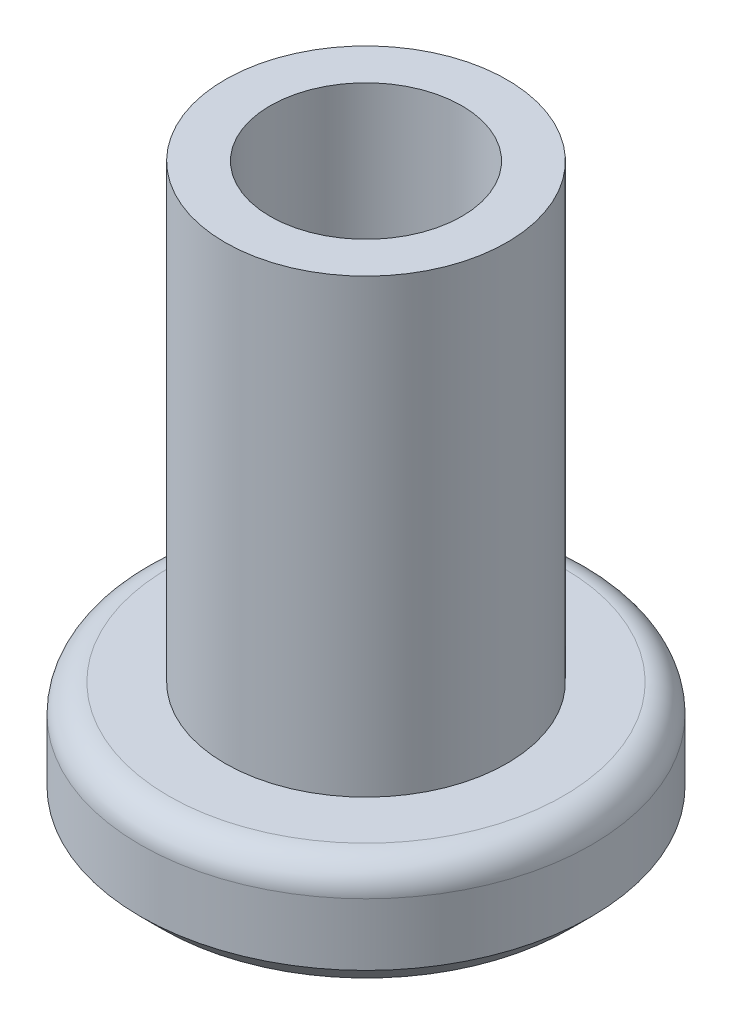
ISO-10303-21;
HEADER;
FILE_DESCRIPTION(('STEP AP214'),'2;1');
FILE_NAME('part.step','',(''),(''),'','','');
FILE_SCHEMA(('AUTOMOTIVE_DESIGN { 1 0 10303 214 1 1 1 1 }'));
ENDSEC;
DATA;
#1=APPLICATION_CONTEXT('core data for automotive mechanical design processes');
#2=APPLICATION_PROTOCOL_DEFINITION('international standard','automotive_design',2000,#1);
#3=PRODUCT_CONTEXT('',#1,'mechanical');
#4=PRODUCT('Part','Part','',(#3));
#5=PRODUCT_RELATED_PRODUCT_CATEGORY('part','',(#4));
#6=PRODUCT_DEFINITION_FORMATION('','',#4);
#7=PRODUCT_DEFINITION_CONTEXT('part definition',#1,'design');
#8=PRODUCT_DEFINITION('design','',#6,#7);
#9=PRODUCT_DEFINITION_SHAPE('','',#8);
#10=(LENGTH_UNIT() NAMED_UNIT(*) SI_UNIT(.MILLI.,.METRE.));
#11=(NAMED_UNIT(*) PLANE_ANGLE_UNIT() SI_UNIT($,.RADIAN.));
#12=(NAMED_UNIT(*) SI_UNIT($,.STERADIAN.) SOLID_ANGLE_UNIT());
#13=UNCERTAINTY_MEASURE_WITH_UNIT(LENGTH_MEASURE(1.E-05),#10,'distance_accuracy_value','');
#14=(GEOMETRIC_REPRESENTATION_CONTEXT(3) GLOBAL_UNCERTAINTY_ASSIGNED_CONTEXT((#13)) GLOBAL_UNIT_ASSIGNED_CONTEXT((#10,
#11,#12)) REPRESENTATION_CONTEXT('',''));
#15=CARTESIAN_POINT('',(0.,0.,0.));
#16=DIRECTION('',(0.,0.,1.));
#17=DIRECTION('',(1.,0.,0.));
#18=AXIS2_PLACEMENT_3D('',#15,#16,#17);
#19=CARTESIAN_POINT('',(0.,8.,0.));
#20=DIRECTION('',(0.,-1.,0.));
#21=DIRECTION('',(0.,0.,-1.));
#22=AXIS2_PLACEMENT_3D('',#19,#20,#21);
#23=CYLINDRICAL_SURFACE('',#22,1.7);
#24=CARTESIAN_POINT('',(0.,-1.6,0.));
#25=DIRECTION('',(0.,1.,0.));
#26=DIRECTION('',(0.,0.,1.));
#27=AXIS2_PLACEMENT_3D('',#24,#25,#26);
#28=CIRCLE('',#27,1.7);
#29=CARTESIAN_POINT('',(0.,-1.6,1.7));
#30=VERTEX_POINT('',#29);
#31=EDGE_CURVE('E10',#30,#30,#28,.F.);
#32=ORIENTED_EDGE('',*,*,#31,.T.);
#33=EDGE_LOOP('',(#32));
#34=FACE_BOUND('',#33,.T.);
#35=CARTESIAN_POINT('',(0.,8.,0.));
#36=DIRECTION('',(0.,1.,0.));
#37=DIRECTION('',(0.,0.,1.));
#38=AXIS2_PLACEMENT_3D('',#35,#36,#37);
#39=CIRCLE('',#38,1.7);
#40=CARTESIAN_POINT('',(0.,8.,1.7));
#41=VERTEX_POINT('',#40);
#42=EDGE_CURVE('E79',#41,#41,#39,.T.);
#43=ORIENTED_EDGE('',*,*,#42,.T.);
#44=EDGE_LOOP('',(#43));
#45=FACE_BOUND('',#44,.T.);
#46=ADVANCED_FACE('F40',(#34,#45),#23,.F.);
#47=CARTESIAN_POINT('',(0.,8.,0.));
#48=DIRECTION('',(0.,-1.,0.));
#49=DIRECTION('',(0.,0.,-1.));
#50=AXIS2_PLACEMENT_3D('',#47,#48,#49);
#51=CYLINDRICAL_SURFACE('',#50,2.5);
#52=CARTESIAN_POINT('',(0.,8.,0.));
#53=DIRECTION('',(0.,1.,0.));
#54=DIRECTION('',(0.,0.,1.));
#55=AXIS2_PLACEMENT_3D('',#52,#53,#54);
#56=CIRCLE('',#55,2.5);
#57=CARTESIAN_POINT('',(0.,8.,2.5));
#58=VERTEX_POINT('',#57);
#59=EDGE_CURVE('E74',#58,#58,#56,.T.);
#60=ORIENTED_EDGE('',*,*,#59,.F.);
#61=EDGE_LOOP('',(#60));
#62=FACE_BOUND('',#61,.T.);
#63=CARTESIAN_POINT('',(0.,0.,0.));
#64=DIRECTION('',(0.,1.,0.));
#65=DIRECTION('',(0.,0.,1.));
#66=AXIS2_PLACEMENT_3D('',#63,#64,#65);
#67=CIRCLE('',#66,2.5);
#68=CARTESIAN_POINT('',(0.,0.,2.5));
#69=VERTEX_POINT('',#68);
#70=EDGE_CURVE('E75',#69,#69,#67,.T.);
#71=ORIENTED_EDGE('',*,*,#70,.T.);
#72=EDGE_LOOP('',(#71));
#73=FACE_BOUND('',#72,.T.);
#74=ADVANCED_FACE('F91',(#62,#73),#51,.T.);
#75=CARTESIAN_POINT('',(0.,8.,0.));
#76=DIRECTION('',(0.,1.,0.));
#77=DIRECTION('',(0.,0.,1.));
#78=AXIS2_PLACEMENT_3D('',#75,#76,#77);
#79=PLANE('',#78);
#80=ORIENTED_EDGE('',*,*,#42,.F.);
#81=EDGE_LOOP('',(#80));
#82=FACE_BOUND('',#81,.T.);
#83=ORIENTED_EDGE('',*,*,#59,.T.);
#84=EDGE_LOOP('',(#83));
#85=FACE_BOUND('',#84,.T.);
#86=ADVANCED_FACE('F87',(#82,#85),#79,.T.);
#87=CARTESIAN_POINT('',(0.,-2.,0.));
#88=DIRECTION('',(0.,1.,0.));
#89=DIRECTION('',(0.,0.,1.));
#90=AXIS2_PLACEMENT_3D('',#87,#88,#89);
#91=CYLINDRICAL_SURFACE('',#90,4.);
#92=CARTESIAN_POINT('',(0.,-1.6,0.));
#93=DIRECTION('',(0.,1.,0.));
#94=DIRECTION('',(0.,0.,1.));
#95=AXIS2_PLACEMENT_3D('',#92,#93,#94);
#96=CIRCLE('',#95,4.);
#97=CARTESIAN_POINT('',(0.,-1.6,4.));
#98=VERTEX_POINT('',#97);
#99=EDGE_CURVE('E61',#98,#98,#96,.T.);
#100=ORIENTED_EDGE('',*,*,#99,.T.);
#101=EDGE_LOOP('',(#100));
#102=FACE_BOUND('',#101,.T.);
#103=CARTESIAN_POINT('',(0.,-0.5,0.));
#104=DIRECTION('',(0.,1.,0.));
#105=DIRECTION('',(0.,0.,1.));
#106=AXIS2_PLACEMENT_3D('',#103,#104,#105);
#107=CIRCLE('',#106,4.);
#108=CARTESIAN_POINT('',(0.,-0.5,4.));
#109=VERTEX_POINT('',#108);
#110=EDGE_CURVE('E67',#109,#109,#107,.F.);
#111=ORIENTED_EDGE('',*,*,#110,.T.);
#112=EDGE_LOOP('',(#111));
#113=FACE_BOUND('',#112,.T.);
#114=ADVANCED_FACE('F90',(#102,#113),#91,.T.);
#115=CARTESIAN_POINT('',(0.,-2.,0.));
#116=DIRECTION('',(0.,1.,0.));
#117=DIRECTION('',(0.,0.,1.));
#118=AXIS2_PLACEMENT_3D('',#115,#116,#117);
#119=PLANE('',#118);
#120=CARTESIAN_POINT('',(0.,-2.,0.));
#121=DIRECTION('',(0.,1.,0.));
#122=DIRECTION('',(0.,0.,1.));
#123=AXIS2_PLACEMENT_3D('',#120,#121,#122);
#124=CIRCLE('',#123,3.6);
#125=CARTESIAN_POINT('',(0.,-2.,3.6));
#126=VERTEX_POINT('',#125);
#127=EDGE_CURVE('E49',#126,#126,#124,.F.);
#128=ORIENTED_EDGE('',*,*,#127,.T.);
#129=EDGE_LOOP('',(#128));
#130=FACE_BOUND('',#129,.T.);
#131=CARTESIAN_POINT('',(0.,-2.,0.));
#132=DIRECTION('',(0.,1.,0.));
#133=DIRECTION('',(0.,0.,1.));
#134=AXIS2_PLACEMENT_3D('',#131,#132,#133);
#135=CIRCLE('',#134,2.1);
#136=CARTESIAN_POINT('',(0.,-2.,2.1));
#137=VERTEX_POINT('',#136);
#138=EDGE_CURVE('E55',#137,#137,#135,.T.);
#139=ORIENTED_EDGE('',*,*,#138,.T.);
#140=EDGE_LOOP('',(#139));
#141=FACE_BOUND('',#140,.T.);
#142=ADVANCED_FACE('F103',(#130,#141),#119,.F.);
#143=CARTESIAN_POINT('',(0.,0.,0.));
#144=DIRECTION('',(0.,1.,0.));
#145=DIRECTION('',(0.,0.,1.));
#146=AXIS2_PLACEMENT_3D('',#143,#144,#145);
#147=PLANE('',#146);
#148=CARTESIAN_POINT('',(0.,0.,0.));
#149=DIRECTION('',(0.,1.,0.));
#150=DIRECTION('',(0.,0.,1.));
#151=AXIS2_PLACEMENT_3D('',#148,#149,#150);
#152=CIRCLE('',#151,3.5);
#153=CARTESIAN_POINT('',(0.,0.,3.5));
#154=VERTEX_POINT('',#153);
#155=EDGE_CURVE('E71',#154,#154,#152,.T.);
#156=ORIENTED_EDGE('',*,*,#155,.T.);
#157=EDGE_LOOP('',(#156));
#158=FACE_BOUND('',#157,.T.);
#159=ORIENTED_EDGE('',*,*,#70,.F.);
#160=EDGE_LOOP('',(#159));
#161=FACE_BOUND('',#160,.T.);
#162=ADVANCED_FACE('F100',(#158,#161),#147,.T.);
#163=CARTESIAN_POINT('',(0.,-0.5,0.));
#164=DIRECTION('',(0.,1.,0.));
#165=DIRECTION('',(0.,0.,1.));
#166=AXIS2_PLACEMENT_3D('',#163,#164,#165);
#167=TOROIDAL_SURFACE('',#166,3.5,0.5);
#168=ORIENTED_EDGE('',*,*,#110,.F.);
#169=EDGE_LOOP('',(#168));
#170=FACE_BOUND('',#169,.T.);
#171=ORIENTED_EDGE('',*,*,#155,.F.);
#172=EDGE_LOOP('',(#171));
#173=FACE_BOUND('',#172,.T.);
#174=ADVANCED_FACE('F102',(#170,#173),#167,.T.);
#175=CARTESIAN_POINT('',(0.,-1.6,0.));
#176=DIRECTION('',(0.,1.,0.));
#177=DIRECTION('',(0.,0.,1.));
#178=AXIS2_PLACEMENT_3D('',#175,#176,#177);
#179=CONICAL_SURFACE('',#178,4.,0.78539816339745);
#180=CARTESIAN_POINT('',(0.,-2.,3.6));
#181=CARTESIAN_POINT('',(0.,-1.99583333333333,3.60416666666667));
#182=CARTESIAN_POINT('',(0.,-1.99166666666667,3.60833333333333));
#183=CARTESIAN_POINT('',(0.,-1.98333333333333,3.61666666666667));
#184=CARTESIAN_POINT('',(0.,-1.97916666666667,3.62083333333333));
#185=CARTESIAN_POINT('',(0.,-1.97083333333333,3.62916666666667));
#186=CARTESIAN_POINT('',(0.,-1.96666666666667,3.63333333333333));
#187=CARTESIAN_POINT('',(0.,-1.95833333333333,3.64166666666667));
#188=CARTESIAN_POINT('',(0.,-1.95416666666667,3.64583333333333));
#189=CARTESIAN_POINT('',(0.,-1.94583333333333,3.65416666666667));
#190=CARTESIAN_POINT('',(0.,-1.94166666666667,3.65833333333333));
#191=CARTESIAN_POINT('',(0.,-1.93333333333333,3.66666666666667));
#192=CARTESIAN_POINT('',(0.,-1.92916666666667,3.67083333333333));
#193=CARTESIAN_POINT('',(0.,-1.92083333333333,3.67916666666667));
#194=CARTESIAN_POINT('',(0.,-1.91666666666667,3.68333333333333));
#195=CARTESIAN_POINT('',(0.,-1.90833333333333,3.69166666666667));
#196=CARTESIAN_POINT('',(0.,-1.90416666666667,3.69583333333333));
#197=CARTESIAN_POINT('',(0.,-1.89583333333333,3.70416666666667));
#198=CARTESIAN_POINT('',(0.,-1.89166666666667,3.70833333333333));
#199=CARTESIAN_POINT('',(0.,-1.88333333333333,3.71666666666667));
#200=CARTESIAN_POINT('',(0.,-1.87916666666667,3.72083333333333));
#201=CARTESIAN_POINT('',(0.,-1.87083333333333,3.72916666666667));
#202=CARTESIAN_POINT('',(0.,-1.86666666666667,3.73333333333333));
#203=CARTESIAN_POINT('',(0.,-1.85833333333333,3.74166666666667));
#204=CARTESIAN_POINT('',(0.,-1.85416666666667,3.74583333333333));
#205=CARTESIAN_POINT('',(0.,-1.84583333333333,3.75416666666667));
#206=CARTESIAN_POINT('',(0.,-1.84166666666667,3.75833333333333));
#207=CARTESIAN_POINT('',(0.,-1.83333333333333,3.76666666666667));
#208=CARTESIAN_POINT('',(0.,-1.82916666666667,3.77083333333333));
#209=CARTESIAN_POINT('',(0.,-1.82083333333333,3.77916666666667));
#210=CARTESIAN_POINT('',(0.,-1.81666666666667,3.78333333333333));
#211=CARTESIAN_POINT('',(0.,-1.80833333333333,3.79166666666667));
#212=CARTESIAN_POINT('',(0.,-1.80416666666667,3.79583333333333));
#213=CARTESIAN_POINT('',(0.,-1.79583333333333,3.80416666666667));
#214=CARTESIAN_POINT('',(0.,-1.79166666666667,3.80833333333333));
#215=CARTESIAN_POINT('',(0.,-1.78333333333333,3.81666666666667));
#216=CARTESIAN_POINT('',(0.,-1.77916666666667,3.82083333333333));
#217=CARTESIAN_POINT('',(0.,-1.77083333333333,3.82916666666667));
#218=CARTESIAN_POINT('',(0.,-1.76666666666667,3.83333333333333));
#219=CARTESIAN_POINT('',(0.,-1.75833333333333,3.84166666666667));
#220=CARTESIAN_POINT('',(0.,-1.75416666666667,3.84583333333333));
#221=CARTESIAN_POINT('',(0.,-1.74583333333333,3.85416666666667));
#222=CARTESIAN_POINT('',(0.,-1.74166666666667,3.85833333333333));
#223=CARTESIAN_POINT('',(0.,-1.73333333333333,3.86666666666667));
#224=CARTESIAN_POINT('',(0.,-1.72916666666667,3.87083333333333));
#225=CARTESIAN_POINT('',(0.,-1.72083333333333,3.87916666666667));
#226=CARTESIAN_POINT('',(0.,-1.71666666666667,3.88333333333333));
#227=CARTESIAN_POINT('',(0.,-1.70833333333333,3.89166666666667));
#228=CARTESIAN_POINT('',(0.,-1.70416666666667,3.89583333333333));
#229=CARTESIAN_POINT('',(0.,-1.69583333333333,3.90416666666667));
#230=CARTESIAN_POINT('',(0.,-1.69166666666667,3.90833333333333));
#231=CARTESIAN_POINT('',(0.,-1.68333333333333,3.91666666666667));
#232=CARTESIAN_POINT('',(0.,-1.67916666666667,3.92083333333333));
#233=CARTESIAN_POINT('',(0.,-1.67083333333333,3.92916666666667));
#234=CARTESIAN_POINT('',(0.,-1.66666666666667,3.93333333333333));
#235=CARTESIAN_POINT('',(0.,-1.65833333333333,3.94166666666667));
#236=CARTESIAN_POINT('',(0.,-1.65416666666667,3.94583333333333));
#237=CARTESIAN_POINT('',(0.,-1.64583333333333,3.95416666666667));
#238=CARTESIAN_POINT('',(0.,-1.64166666666667,3.95833333333333));
#239=CARTESIAN_POINT('',(0.,-1.63333333333333,3.96666666666667));
#240=CARTESIAN_POINT('',(0.,-1.62916666666667,3.97083333333333));
#241=CARTESIAN_POINT('',(0.,-1.62083333333333,3.97916666666667));
#242=CARTESIAN_POINT('',(0.,-1.61666666666667,3.98333333333333));
#243=CARTESIAN_POINT('',(0.,-1.60833333333333,3.99166666666667));
#244=CARTESIAN_POINT('',(0.,-1.60416666666667,3.99583333333333));
#245=CARTESIAN_POINT('',(0.,-1.6,4.));
#246=B_SPLINE_CURVE_WITH_KNOTS('',3,(#180,#181,#182,#183,#184,#185,#186,#187,#188,#189,#190,
#191,#192,#193,#194,#195,#196,#197,#198,#199,#200,#201,#202,#203,#204,#205,#206,#207,#208,#209,
#210,#211,#212,#213,#214,#215,#216,#217,#218,#219,#220,#221,#222,#223,#224,#225,#226,#227,#228,
#229,#230,#231,#232,#233,#234,#235,#236,#237,#238,#239,#240,#241,#242,#243,#244,#245),
.UNSPECIFIED.,.F.,.F.,(4,2,2,2,2,2,2,2,2,2,2,2,2,2,2,2,2,2,2,2,2,2,2,2,2,2,2,2,2,2,2,2,4),(0.,
0.0176776695296639,0.0353553390593278,0.0530330085889914,0.0707106781186549,0.0883883476483188,
0.106066017177982,0.123743686707646,0.14142135623731,0.159099025766974,0.176776695296637,
0.194454364826301,0.212132034355965,0.229809703885628,0.247487373415292,0.265165042944956,
0.28284271247462,0.300520382004283,0.318198051533947,0.335875721063611,0.353553390593274,
0.371231060122938,0.388908729652602,0.406586399182265,0.424264068711929,0.441941738241593,
0.459619407771257,0.47729707730092,0.494974746830584,0.512652416360248,0.530330085889912,
0.548007755419575,0.565685424949239),.UNSPECIFIED.);
#247=EDGE_CURVE('BSEAM110',#126,#98,#246,.T.);
#248=ORIENTED_EDGE('',*,*,#127,.F.);
#249=ORIENTED_EDGE('',*,*,#99,.F.);
#250=ORIENTED_EDGE('',*,*,#247,.T.);
#251=ORIENTED_EDGE('',*,*,#247,.F.);
#252=EDGE_LOOP('',(#248,#250,#249,#251));
#253=FACE_BOUND('',#252,.T.);
#254=ADVANCED_FACE('F110',(#253),#179,.T.);
#255=CARTESIAN_POINT('',(0.,-2.,0.));
#256=DIRECTION('',(0.,-1.,0.));
#257=DIRECTION('',(0.,0.,-1.));
#258=AXIS2_PLACEMENT_3D('',#255,#256,#257);
#259=CONICAL_SURFACE('',#258,2.1,0.785398163397446);
#260=ORIENTED_EDGE('',*,*,#31,.F.);
#261=EDGE_LOOP('',(#260));
#262=FACE_BOUND('',#261,.T.);
#263=ORIENTED_EDGE('',*,*,#138,.F.);
#264=EDGE_LOOP('',(#263));
#265=FACE_BOUND('',#264,.T.);
#266=ADVANCED_FACE('F43',(#262,#265),#259,.F.);
#267=CLOSED_SHELL('',(#46,#74,#86,#114,#142,#162,#174,#254,#266));
#268=MANIFOLD_SOLID_BREP('B2',#267);
#269=ADVANCED_BREP_SHAPE_REPRESENTATION('',(#18,#268),#14);
#270=SHAPE_DEFINITION_REPRESENTATION(#9,#269);
ENDSEC;
END-ISO-10303-21;
